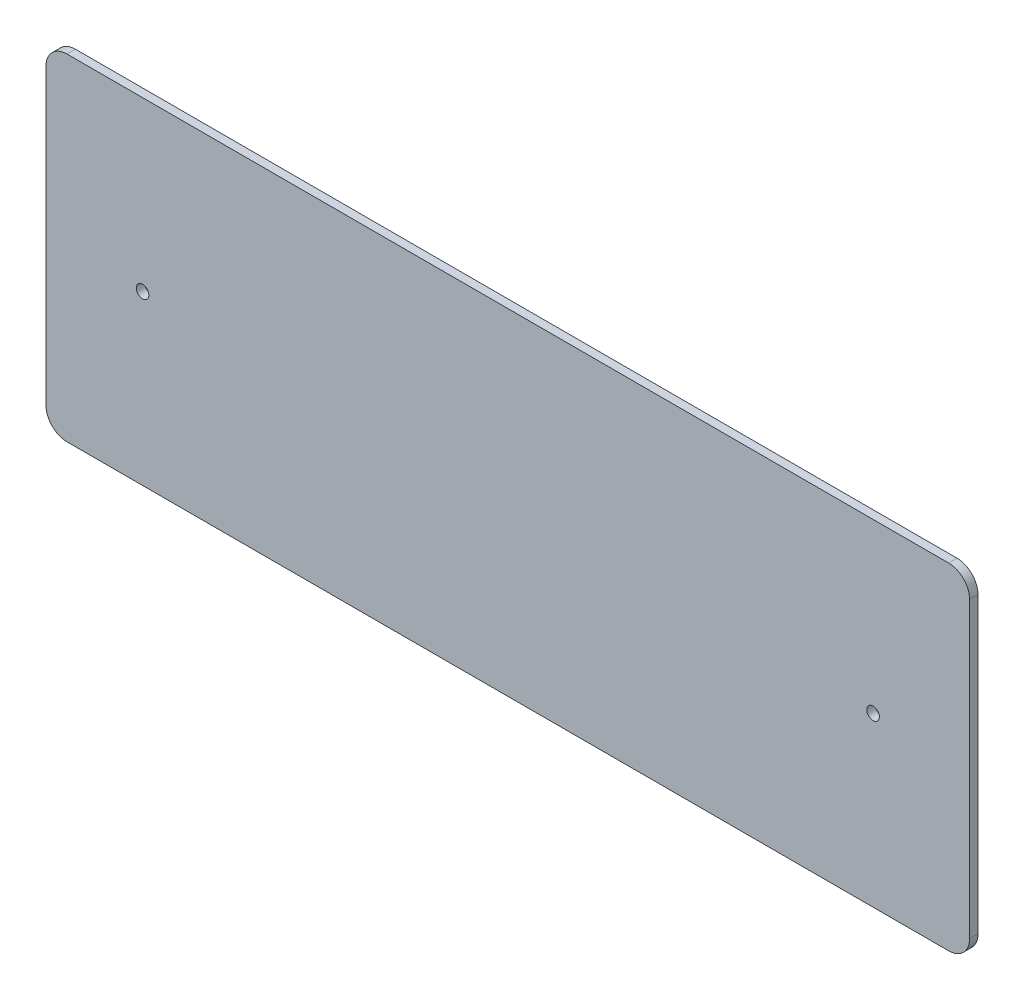
ISO-10303-21;
HEADER;
FILE_DESCRIPTION(('STEP AP214'),'2;1');
FILE_NAME('part.step','',(''),(''),'','','');
FILE_SCHEMA(('AUTOMOTIVE_DESIGN { 1 0 10303 214 1 1 1 1 }'));
ENDSEC;
DATA;
#1=APPLICATION_CONTEXT('core data for automotive mechanical design processes');
#2=APPLICATION_PROTOCOL_DEFINITION('international standard','automotive_design',2000,#1);
#3=PRODUCT_CONTEXT('',#1,'mechanical');
#4=PRODUCT('Part','Part','',(#3));
#5=PRODUCT_RELATED_PRODUCT_CATEGORY('part','',(#4));
#6=PRODUCT_DEFINITION_FORMATION('','',#4);
#7=PRODUCT_DEFINITION_CONTEXT('part definition',#1,'design');
#8=PRODUCT_DEFINITION('design','',#6,#7);
#9=PRODUCT_DEFINITION_SHAPE('','',#8);
#10=(LENGTH_UNIT() NAMED_UNIT(*) SI_UNIT(.MILLI.,.METRE.));
#11=(NAMED_UNIT(*) PLANE_ANGLE_UNIT() SI_UNIT($,.RADIAN.));
#12=(NAMED_UNIT(*) SI_UNIT($,.STERADIAN.) SOLID_ANGLE_UNIT());
#13=UNCERTAINTY_MEASURE_WITH_UNIT(LENGTH_MEASURE(1.E-05),#10,'distance_accuracy_value','');
#14=(GEOMETRIC_REPRESENTATION_CONTEXT(3) GLOBAL_UNCERTAINTY_ASSIGNED_CONTEXT((#13)) GLOBAL_UNIT_ASSIGNED_CONTEXT((#10,
#11,#12)) REPRESENTATION_CONTEXT('',''));
#15=CARTESIAN_POINT('',(0.,0.,0.));
#16=DIRECTION('',(0.,0.,1.));
#17=DIRECTION('',(1.,0.,0.));
#18=AXIS2_PLACEMENT_3D('',#15,#16,#17);
#19=CARTESIAN_POINT('',(110.,0.,2.));
#20=DIRECTION('',(1.,0.,0.));
#21=DIRECTION('',(0.,0.,-1.));
#22=AXIS2_PLACEMENT_3D('',#19,#20,#21);
#23=PLANE('',#22);
#24=DIRECTION('',(0.,-1.,0.));
#25=VECTOR('',#24,1.);
#26=CARTESIAN_POINT('',(110.,0.,2.));
#27=LINE('',#26,#25);
#28=CARTESIAN_POINT('',(110.,35.,2.));
#29=VERTEX_POINT('',#28);
#30=CARTESIAN_POINT('',(110.,-35.,2.));
#31=VERTEX_POINT('',#30);
#32=EDGE_CURVE('E174',#29,#31,#27,.T.);
#33=ORIENTED_EDGE('',*,*,#32,.T.);
#34=DIRECTION('',(0.,0.,-1.));
#35=VECTOR('',#34,1.);
#36=CARTESIAN_POINT('',(110.,-35.,0.));
#37=LINE('',#36,#35);
#38=CARTESIAN_POINT('',(110.,-35.,0.));
#39=VERTEX_POINT('',#38);
#40=EDGE_CURVE('E120',#31,#39,#37,.T.);
#41=ORIENTED_EDGE('',*,*,#40,.T.);
#42=DIRECTION('',(0.,-1.,0.));
#43=VECTOR('',#42,1.);
#44=CARTESIAN_POINT('',(110.,0.,0.));
#45=LINE('',#44,#43);
#46=CARTESIAN_POINT('',(110.,35.,0.));
#47=VERTEX_POINT('',#46);
#48=EDGE_CURVE('E104',#47,#39,#45,.T.);
#49=ORIENTED_EDGE('',*,*,#48,.F.);
#50=DIRECTION('',(0.,0.,-1.));
#51=VECTOR('',#50,1.);
#52=CARTESIAN_POINT('',(110.,35.,2.));
#53=LINE('',#52,#51);
#54=EDGE_CURVE('E117',#47,#29,#53,.F.);
#55=ORIENTED_EDGE('',*,*,#54,.T.);
#56=EDGE_LOOP('',(#33,#41,#49,#55));
#57=FACE_BOUND('',#56,.T.);
#58=ADVANCED_FACE('F36',(#57),#23,.T.);
#59=CARTESIAN_POINT('',(0.,40.,2.));
#60=DIRECTION('',(0.,1.,0.));
#61=DIRECTION('',(0.,0.,1.));
#62=AXIS2_PLACEMENT_3D('',#59,#60,#61);
#63=PLANE('',#62);
#64=DIRECTION('',(1.,0.,0.));
#65=VECTOR('',#64,1.);
#66=CARTESIAN_POINT('',(0.,40.,2.));
#67=LINE('',#66,#65);
#68=CARTESIAN_POINT('',(-105.,40.,2.));
#69=VERTEX_POINT('',#68);
#70=CARTESIAN_POINT('',(105.,40.,2.));
#71=VERTEX_POINT('',#70);
#72=EDGE_CURVE('E171',#69,#71,#67,.T.);
#73=ORIENTED_EDGE('',*,*,#72,.T.);
#74=DIRECTION('',(0.,0.,-1.));
#75=VECTOR('',#74,1.);
#76=CARTESIAN_POINT('',(105.,40.,2.));
#77=LINE('',#76,#75);
#78=CARTESIAN_POINT('',(105.,40.,0.));
#79=VERTEX_POINT('',#78);
#80=EDGE_CURVE('E153',#71,#79,#77,.T.);
#81=ORIENTED_EDGE('',*,*,#80,.T.);
#82=DIRECTION('',(1.,0.,0.));
#83=VECTOR('',#82,1.);
#84=CARTESIAN_POINT('',(0.,40.,0.));
#85=LINE('',#84,#83);
#86=CARTESIAN_POINT('',(-105.,40.,0.));
#87=VERTEX_POINT('',#86);
#88=EDGE_CURVE('E106',#87,#79,#85,.T.);
#89=ORIENTED_EDGE('',*,*,#88,.F.);
#90=DIRECTION('',(0.,0.,-1.));
#91=VECTOR('',#90,1.);
#92=CARTESIAN_POINT('',(-105.,40.,2.));
#93=LINE('',#92,#91);
#94=EDGE_CURVE('E151',#87,#69,#93,.F.);
#95=ORIENTED_EDGE('',*,*,#94,.T.);
#96=EDGE_LOOP('',(#73,#81,#89,#95));
#97=FACE_BOUND('',#96,.T.);
#98=ADVANCED_FACE('F208',(#97),#63,.T.);
#99=CARTESIAN_POINT('',(-110.,0.,2.));
#100=DIRECTION('',(1.,0.,0.));
#101=DIRECTION('',(0.,0.,-1.));
#102=AXIS2_PLACEMENT_3D('',#99,#100,#101);
#103=PLANE('',#102);
#104=DIRECTION('',(0.,-1.,0.));
#105=VECTOR('',#104,1.);
#106=CARTESIAN_POINT('',(-110.,0.,0.));
#107=LINE('',#106,#105);
#108=CARTESIAN_POINT('',(-110.,35.,0.));
#109=VERTEX_POINT('',#108);
#110=CARTESIAN_POINT('',(-110.,-35.,0.));
#111=VERTEX_POINT('',#110);
#112=EDGE_CURVE('E158',#109,#111,#107,.T.);
#113=ORIENTED_EDGE('',*,*,#112,.T.);
#114=DIRECTION('',(0.,0.,-1.));
#115=VECTOR('',#114,1.);
#116=CARTESIAN_POINT('',(-110.,-35.,2.));
#117=LINE('',#116,#115);
#118=CARTESIAN_POINT('',(-110.,-35.,2.));
#119=VERTEX_POINT('',#118);
#120=EDGE_CURVE('E11',#111,#119,#117,.F.);
#121=ORIENTED_EDGE('',*,*,#120,.T.);
#122=DIRECTION('',(0.,-1.,0.));
#123=VECTOR('',#122,1.);
#124=CARTESIAN_POINT('',(-110.,0.,2.));
#125=LINE('',#124,#123);
#126=CARTESIAN_POINT('',(-110.,35.,2.));
#127=VERTEX_POINT('',#126);
#128=EDGE_CURVE('E131',#127,#119,#125,.T.);
#129=ORIENTED_EDGE('',*,*,#128,.F.);
#130=DIRECTION('',(0.,0.,-1.));
#131=VECTOR('',#130,1.);
#132=CARTESIAN_POINT('',(-110.,35.,0.));
#133=LINE('',#132,#131);
#134=EDGE_CURVE('E44',#127,#109,#133,.T.);
#135=ORIENTED_EDGE('',*,*,#134,.T.);
#136=EDGE_LOOP('',(#113,#121,#129,#135));
#137=FACE_BOUND('',#136,.T.);
#138=ADVANCED_FACE('F157',(#137),#103,.F.);
#139=CARTESIAN_POINT('',(-87.,0.,2.));
#140=DIRECTION('',(0.,0.,-1.));
#141=DIRECTION('',(-1.,0.,0.));
#142=AXIS2_PLACEMENT_3D('',#139,#140,#141);
#143=CYLINDRICAL_SURFACE('',#142,1.5);
#144=CARTESIAN_POINT('',(-87.,0.,2.));
#145=DIRECTION('',(0.,0.,1.));
#146=DIRECTION('',(1.,0.,0.));
#147=AXIS2_PLACEMENT_3D('',#144,#145,#146);
#148=CIRCLE('',#147,1.5);
#149=CARTESIAN_POINT('',(-85.5,0.,2.));
#150=VERTEX_POINT('',#149);
#151=EDGE_CURVE('E176',#150,#150,#148,.T.);
#152=ORIENTED_EDGE('',*,*,#151,.T.);
#153=EDGE_LOOP('',(#152));
#154=FACE_BOUND('',#153,.T.);
#155=CARTESIAN_POINT('',(-87.,0.,0.));
#156=DIRECTION('',(0.,0.,1.));
#157=DIRECTION('',(1.,0.,0.));
#158=AXIS2_PLACEMENT_3D('',#155,#156,#157);
#159=CIRCLE('',#158,1.5);
#160=CARTESIAN_POINT('',(-85.5,0.,0.));
#161=VERTEX_POINT('',#160);
#162=EDGE_CURVE('E121',#161,#161,#159,.T.);
#163=ORIENTED_EDGE('',*,*,#162,.F.);
#164=EDGE_LOOP('',(#163));
#165=FACE_BOUND('',#164,.T.);
#166=ADVANCED_FACE('F217',(#154,#165),#143,.F.);
#167=CARTESIAN_POINT('',(87.,0.,2.));
#168=DIRECTION('',(0.,0.,-1.));
#169=DIRECTION('',(-1.,0.,0.));
#170=AXIS2_PLACEMENT_3D('',#167,#168,#169);
#171=CYLINDRICAL_SURFACE('',#170,1.5);
#172=CARTESIAN_POINT('',(87.,0.,2.));
#173=DIRECTION('',(0.,0.,1.));
#174=DIRECTION('',(1.,0.,0.));
#175=AXIS2_PLACEMENT_3D('',#172,#173,#174);
#176=CIRCLE('',#175,1.5);
#177=CARTESIAN_POINT('',(88.5,0.,2.));
#178=VERTEX_POINT('',#177);
#179=EDGE_CURVE('E162',#178,#178,#176,.T.);
#180=ORIENTED_EDGE('',*,*,#179,.T.);
#181=EDGE_LOOP('',(#180));
#182=FACE_BOUND('',#181,.T.);
#183=CARTESIAN_POINT('',(87.,0.,0.));
#184=DIRECTION('',(0.,0.,1.));
#185=DIRECTION('',(1.,0.,0.));
#186=AXIS2_PLACEMENT_3D('',#183,#184,#185);
#187=CIRCLE('',#186,1.5);
#188=CARTESIAN_POINT('',(88.5,0.,0.));
#189=VERTEX_POINT('',#188);
#190=EDGE_CURVE('E167',#189,#189,#187,.T.);
#191=ORIENTED_EDGE('',*,*,#190,.F.);
#192=EDGE_LOOP('',(#191));
#193=FACE_BOUND('',#192,.T.);
#194=ADVANCED_FACE('F182',(#182,#193),#171,.F.);
#195=CARTESIAN_POINT('',(0.,-40.,2.));
#196=DIRECTION('',(0.,1.,0.));
#197=DIRECTION('',(0.,0.,1.));
#198=AXIS2_PLACEMENT_3D('',#195,#196,#197);
#199=PLANE('',#198);
#200=DIRECTION('',(1.,0.,0.));
#201=VECTOR('',#200,1.);
#202=CARTESIAN_POINT('',(0.,-40.,0.));
#203=LINE('',#202,#201);
#204=CARTESIAN_POINT('',(-105.,-40.,0.));
#205=VERTEX_POINT('',#204);
#206=CARTESIAN_POINT('',(105.,-40.,0.));
#207=VERTEX_POINT('',#206);
#208=EDGE_CURVE('E134',#205,#207,#203,.T.);
#209=ORIENTED_EDGE('',*,*,#208,.T.);
#210=DIRECTION('',(0.,0.,-1.));
#211=VECTOR('',#210,1.);
#212=CARTESIAN_POINT('',(105.,-40.,2.));
#213=LINE('',#212,#211);
#214=CARTESIAN_POINT('',(105.,-40.,2.));
#215=VERTEX_POINT('',#214);
#216=EDGE_CURVE('E143',#207,#215,#213,.F.);
#217=ORIENTED_EDGE('',*,*,#216,.T.);
#218=DIRECTION('',(1.,0.,0.));
#219=VECTOR('',#218,1.);
#220=CARTESIAN_POINT('',(0.,-40.,2.));
#221=LINE('',#220,#219);
#222=CARTESIAN_POINT('',(-105.,-40.,2.));
#223=VERTEX_POINT('',#222);
#224=EDGE_CURVE('E126',#223,#215,#221,.T.);
#225=ORIENTED_EDGE('',*,*,#224,.F.);
#226=DIRECTION('',(0.,0.,-1.));
#227=VECTOR('',#226,1.);
#228=CARTESIAN_POINT('',(-105.,-40.,2.));
#229=LINE('',#228,#227);
#230=EDGE_CURVE('E140',#223,#205,#229,.T.);
#231=ORIENTED_EDGE('',*,*,#230,.T.);
#232=EDGE_LOOP('',(#209,#217,#225,#231));
#233=FACE_BOUND('',#232,.T.);
#234=ADVANCED_FACE('F188',(#233),#199,.F.);
#235=CARTESIAN_POINT('',(0.,0.,2.));
#236=DIRECTION('',(0.,0.,1.));
#237=DIRECTION('',(1.,0.,0.));
#238=AXIS2_PLACEMENT_3D('',#235,#236,#237);
#239=PLANE('',#238);
#240=ORIENTED_EDGE('',*,*,#179,.F.);
#241=EDGE_LOOP('',(#240));
#242=FACE_BOUND('',#241,.T.);
#243=ORIENTED_EDGE('',*,*,#151,.F.);
#244=EDGE_LOOP('',(#243));
#245=FACE_BOUND('',#244,.T.);
#246=ORIENTED_EDGE('',*,*,#224,.T.);
#247=CARTESIAN_POINT('',(105.,-35.,2.));
#248=DIRECTION('',(0.,0.,1.));
#249=DIRECTION('',(1.,0.,0.));
#250=AXIS2_PLACEMENT_3D('',#247,#248,#249);
#251=CIRCLE('',#250,5.);
#252=EDGE_CURVE('E149',#215,#31,#251,.T.);
#253=ORIENTED_EDGE('',*,*,#252,.T.);
#254=ORIENTED_EDGE('',*,*,#32,.F.);
#255=CARTESIAN_POINT('',(105.,35.,2.));
#256=DIRECTION('',(0.,0.,1.));
#257=DIRECTION('',(1.,0.,0.));
#258=AXIS2_PLACEMENT_3D('',#255,#256,#257);
#259=CIRCLE('',#258,5.);
#260=EDGE_CURVE('E125',#29,#71,#259,.T.);
#261=ORIENTED_EDGE('',*,*,#260,.T.);
#262=ORIENTED_EDGE('',*,*,#72,.F.);
#263=CARTESIAN_POINT('',(-105.,35.,2.));
#264=DIRECTION('',(0.,0.,1.));
#265=DIRECTION('',(1.,0.,0.));
#266=AXIS2_PLACEMENT_3D('',#263,#264,#265);
#267=CIRCLE('',#266,5.);
#268=EDGE_CURVE('E56',#69,#127,#267,.T.);
#269=ORIENTED_EDGE('',*,*,#268,.T.);
#270=ORIENTED_EDGE('',*,*,#128,.T.);
#271=CARTESIAN_POINT('',(-105.,-35.,2.));
#272=DIRECTION('',(0.,0.,1.));
#273=DIRECTION('',(1.,0.,0.));
#274=AXIS2_PLACEMENT_3D('',#271,#272,#273);
#275=CIRCLE('',#274,5.);
#276=EDGE_CURVE('E146',#119,#223,#275,.T.);
#277=ORIENTED_EDGE('',*,*,#276,.T.);
#278=EDGE_LOOP('',(#246,#253,#254,#261,#262,#269,#270,#277));
#279=FACE_BOUND('',#278,.T.);
#280=ADVANCED_FACE('F185',(#242,#245,#279),#239,.T.);
#281=CARTESIAN_POINT('',(0.,0.,0.));
#282=DIRECTION('',(0.,0.,1.));
#283=DIRECTION('',(1.,0.,0.));
#284=AXIS2_PLACEMENT_3D('',#281,#282,#283);
#285=PLANE('',#284);
#286=ORIENTED_EDGE('',*,*,#190,.T.);
#287=EDGE_LOOP('',(#286));
#288=FACE_BOUND('',#287,.T.);
#289=ORIENTED_EDGE('',*,*,#162,.T.);
#290=EDGE_LOOP('',(#289));
#291=FACE_BOUND('',#290,.T.);
#292=ORIENTED_EDGE('',*,*,#48,.T.);
#293=CARTESIAN_POINT('',(105.,-35.,0.));
#294=DIRECTION('',(0.,0.,1.));
#295=DIRECTION('',(1.,0.,0.));
#296=AXIS2_PLACEMENT_3D('',#293,#294,#295);
#297=CIRCLE('',#296,5.);
#298=EDGE_CURVE('E111',#39,#207,#297,.F.);
#299=ORIENTED_EDGE('',*,*,#298,.T.);
#300=ORIENTED_EDGE('',*,*,#208,.F.);
#301=CARTESIAN_POINT('',(-105.,-35.,0.));
#302=DIRECTION('',(0.,0.,1.));
#303=DIRECTION('',(1.,0.,0.));
#304=AXIS2_PLACEMENT_3D('',#301,#302,#303);
#305=CIRCLE('',#304,5.);
#306=EDGE_CURVE('E112',#205,#111,#305,.F.);
#307=ORIENTED_EDGE('',*,*,#306,.T.);
#308=ORIENTED_EDGE('',*,*,#112,.F.);
#309=CARTESIAN_POINT('',(-105.,35.,0.));
#310=DIRECTION('',(0.,0.,1.));
#311=DIRECTION('',(1.,0.,0.));
#312=AXIS2_PLACEMENT_3D('',#309,#310,#311);
#313=CIRCLE('',#312,5.);
#314=EDGE_CURVE('E128',#109,#87,#313,.F.);
#315=ORIENTED_EDGE('',*,*,#314,.T.);
#316=ORIENTED_EDGE('',*,*,#88,.T.);
#317=CARTESIAN_POINT('',(105.,35.,0.));
#318=DIRECTION('',(0.,0.,1.));
#319=DIRECTION('',(1.,0.,0.));
#320=AXIS2_PLACEMENT_3D('',#317,#318,#319);
#321=CIRCLE('',#320,5.);
#322=EDGE_CURVE('E101',#79,#47,#321,.F.);
#323=ORIENTED_EDGE('',*,*,#322,.T.);
#324=EDGE_LOOP('',(#292,#299,#300,#307,#308,#315,#316,#323));
#325=FACE_BOUND('',#324,.T.);
#326=ADVANCED_FACE('F103',(#288,#291,#325),#285,.F.);
#327=CARTESIAN_POINT('',(105.,-35.,2.));
#328=DIRECTION('',(0.,0.,1.));
#329=DIRECTION('',(1.,0.,0.));
#330=AXIS2_PLACEMENT_3D('',#327,#328,#329);
#331=CYLINDRICAL_SURFACE('',#330,5.);
#332=ORIENTED_EDGE('',*,*,#252,.F.);
#333=ORIENTED_EDGE('',*,*,#216,.F.);
#334=ORIENTED_EDGE('',*,*,#298,.F.);
#335=ORIENTED_EDGE('',*,*,#40,.F.);
#336=EDGE_LOOP('',(#332,#333,#334,#335));
#337=FACE_BOUND('',#336,.T.);
#338=ADVANCED_FACE('F198',(#337),#331,.T.);
#339=CARTESIAN_POINT('',(105.,35.,2.));
#340=DIRECTION('',(0.,0.,-1.));
#341=DIRECTION('',(-1.,0.,0.));
#342=AXIS2_PLACEMENT_3D('',#339,#340,#341);
#343=CYLINDRICAL_SURFACE('',#342,5.);
#344=ORIENTED_EDGE('',*,*,#260,.F.);
#345=ORIENTED_EDGE('',*,*,#54,.F.);
#346=ORIENTED_EDGE('',*,*,#322,.F.);
#347=ORIENTED_EDGE('',*,*,#80,.F.);
#348=EDGE_LOOP('',(#344,#345,#346,#347));
#349=FACE_BOUND('',#348,.T.);
#350=ADVANCED_FACE('F124',(#349),#343,.T.);
#351=CARTESIAN_POINT('',(-105.,-35.,2.));
#352=DIRECTION('',(0.,0.,-1.));
#353=DIRECTION('',(-1.,0.,0.));
#354=AXIS2_PLACEMENT_3D('',#351,#352,#353);
#355=CYLINDRICAL_SURFACE('',#354,5.);
#356=ORIENTED_EDGE('',*,*,#276,.F.);
#357=ORIENTED_EDGE('',*,*,#120,.F.);
#358=ORIENTED_EDGE('',*,*,#306,.F.);
#359=ORIENTED_EDGE('',*,*,#230,.F.);
#360=EDGE_LOOP('',(#356,#357,#358,#359));
#361=FACE_BOUND('',#360,.T.);
#362=ADVANCED_FACE('F200',(#361),#355,.T.);
#363=CARTESIAN_POINT('',(-105.,35.,2.));
#364=DIRECTION('',(0.,0.,1.));
#365=DIRECTION('',(1.,0.,0.));
#366=AXIS2_PLACEMENT_3D('',#363,#364,#365);
#367=CYLINDRICAL_SURFACE('',#366,5.);
#368=ORIENTED_EDGE('',*,*,#268,.F.);
#369=ORIENTED_EDGE('',*,*,#94,.F.);
#370=ORIENTED_EDGE('',*,*,#314,.F.);
#371=ORIENTED_EDGE('',*,*,#134,.F.);
#372=EDGE_LOOP('',(#368,#369,#370,#371));
#373=FACE_BOUND('',#372,.T.);
#374=ADVANCED_FACE('F38',(#373),#367,.T.);
#375=CLOSED_SHELL('',(#58,#98,#138,#166,#194,#234,#280,#326,#338,#350,#362,#374));
#376=MANIFOLD_SOLID_BREP('B2',#375);
#377=ADVANCED_BREP_SHAPE_REPRESENTATION('',(#18,#376),#14);
#378=SHAPE_DEFINITION_REPRESENTATION(#9,#377);
ENDSEC;
END-ISO-10303-21;
